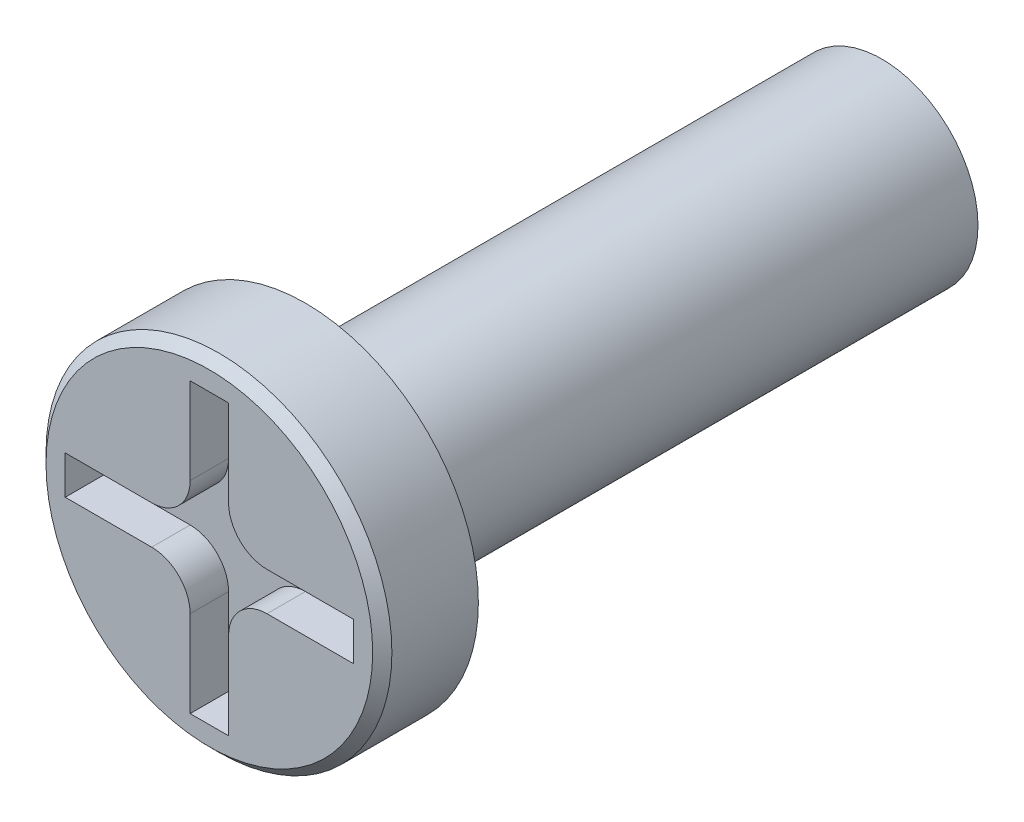
ISO-10303-21;
HEADER;
FILE_DESCRIPTION(('STEP AP214'),'2;1');
FILE_NAME('part.step','',(''),(''),'','','');
FILE_SCHEMA(('AUTOMOTIVE_DESIGN { 1 0 10303 214 1 1 1 1 }'));
ENDSEC;
DATA;
#1=APPLICATION_CONTEXT('core data for automotive mechanical design processes');
#2=APPLICATION_PROTOCOL_DEFINITION('international standard','automotive_design',2000,#1);
#3=PRODUCT_CONTEXT('',#1,'mechanical');
#4=PRODUCT('Part','Part','',(#3));
#5=PRODUCT_RELATED_PRODUCT_CATEGORY('part','',(#4));
#6=PRODUCT_DEFINITION_FORMATION('','',#4);
#7=PRODUCT_DEFINITION_CONTEXT('part definition',#1,'design');
#8=PRODUCT_DEFINITION('design','',#6,#7);
#9=PRODUCT_DEFINITION_SHAPE('','',#8);
#10=(LENGTH_UNIT() NAMED_UNIT(*) SI_UNIT(.MILLI.,.METRE.));
#11=(NAMED_UNIT(*) PLANE_ANGLE_UNIT() SI_UNIT($,.RADIAN.));
#12=(NAMED_UNIT(*) SI_UNIT($,.STERADIAN.) SOLID_ANGLE_UNIT());
#13=UNCERTAINTY_MEASURE_WITH_UNIT(LENGTH_MEASURE(1.E-05),#10,'distance_accuracy_value','');
#14=(GEOMETRIC_REPRESENTATION_CONTEXT(3) GLOBAL_UNCERTAINTY_ASSIGNED_CONTEXT((#13)) GLOBAL_UNIT_ASSIGNED_CONTEXT((#10,
#11,#12)) REPRESENTATION_CONTEXT('',''));
#15=CARTESIAN_POINT('',(0.,0.,0.));
#16=DIRECTION('',(0.,0.,1.));
#17=DIRECTION('',(1.,0.,0.));
#18=AXIS2_PLACEMENT_3D('',#15,#16,#17);
#19=CARTESIAN_POINT('',(2.93483922046847,2.4375,17.5));
#20=DIRECTION('',(0.,0.,1.));
#21=DIRECTION('',(1.,0.,0.));
#22=AXIS2_PLACEMENT_3D('',#19,#20,#21);
#23=PLANE('',#22);
#24=CARTESIAN_POINT('',(2.93483922046847,2.4375,17.5));
#25=DIRECTION('',(0.,0.,-1.));
#26=DIRECTION('',(1.,0.,0.));
#27=AXIS2_PLACEMENT_3D('',#24,#25,#26);
#28=CIRCLE('',#27,0.5);
#29=CARTESIAN_POINT('',(3.43483922046848,2.4375,17.5));
#30=VERTEX_POINT('',#29);
#31=CARTESIAN_POINT('',(2.43483922046847,2.4375,17.5));
#32=VERTEX_POINT('',#31);
#33=EDGE_CURVE('E264',#30,#32,#28,.T.);
#34=ORIENTED_EDGE('',*,*,#33,.T.);
#35=CARTESIAN_POINT('',(2.93483922046847,2.4375,17.5));
#36=DIRECTION('',(0.,0.,-1.));
#37=DIRECTION('',(1.,0.,0.));
#38=AXIS2_PLACEMENT_3D('',#35,#36,#37);
#39=CIRCLE('',#38,0.5);
#40=EDGE_CURVE('E27',#32,#30,#39,.T.);
#41=ORIENTED_EDGE('',*,*,#40,.T.);
#42=EDGE_LOOP('',(#34,#41));
#43=FACE_BOUND('',#42,.T.);
#44=ADVANCED_FACE('F16',(#43),#23,.F.);
#45=CARTESIAN_POINT('',(2.93483922046847,2.4375,20.5));
#46=DIRECTION('',(0.,0.,-1.));
#47=DIRECTION('',(1.,0.,0.));
#48=AXIS2_PLACEMENT_3D('',#45,#46,#47);
#49=CYLINDRICAL_SURFACE('',#48,0.5);
#50=ORIENTED_EDGE('',*,*,#33,.F.);
#51=ORIENTED_EDGE('',*,*,#40,.F.);
#52=DIRECTION('',(0.,0.,1.));
#53=VECTOR('',#52,1.);
#54=CARTESIAN_POINT('',(2.43483922046847,2.4375,20.5));
#55=LINE('',#54,#53);
#56=CARTESIAN_POINT('',(2.43483922046847,2.4375,20.5));
#57=VERTEX_POINT('',#56);
#58=EDGE_CURVE('E11',#32,#57,#55,.T.);
#59=ORIENTED_EDGE('',*,*,#58,.T.);
#60=CARTESIAN_POINT('',(2.93483922046847,2.4375,20.5));
#61=DIRECTION('',(0.,0.,1.));
#62=DIRECTION('',(1.,0.,0.));
#63=AXIS2_PLACEMENT_3D('',#60,#61,#62);
#64=CIRCLE('',#63,0.5);
#65=CARTESIAN_POINT('',(3.43483922046848,2.4375,20.5));
#66=VERTEX_POINT('',#65);
#67=EDGE_CURVE('E239',#66,#57,#64,.T.);
#68=ORIENTED_EDGE('',*,*,#67,.F.);
#69=CARTESIAN_POINT('',(2.93483922046847,2.4375,20.5));
#70=DIRECTION('',(0.,0.,1.));
#71=DIRECTION('',(1.,0.,0.));
#72=AXIS2_PLACEMENT_3D('',#69,#70,#71);
#73=CIRCLE('',#72,0.5);
#74=EDGE_CURVE('E268',#57,#66,#73,.T.);
#75=ORIENTED_EDGE('',*,*,#74,.F.);
#76=ORIENTED_EDGE('',*,*,#58,.F.);
#77=EDGE_LOOP('',(#50,#51,#59,#68,#75,#76));
#78=FACE_BOUND('',#77,.T.);
#79=ADVANCED_FACE('F542',(#78),#49,.T.);
#80=CARTESIAN_POINT('',(2.93483922046847,2.4375,20.5));
#81=DIRECTION('',(0.,0.,1.));
#82=DIRECTION('',(1.,0.,0.));
#83=AXIS2_PLACEMENT_3D('',#80,#81,#82);
#84=PLANE('',#83);
#85=ORIENTED_EDGE('',*,*,#67,.T.);
#86=ORIENTED_EDGE('',*,*,#74,.T.);
#87=EDGE_LOOP('',(#85,#86));
#88=FACE_BOUND('',#87,.T.);
#89=CARTESIAN_POINT('',(2.93483922046847,2.4375,20.5));
#90=DIRECTION('',(0.,0.,1.));
#91=DIRECTION('',(1.,0.,0.));
#92=AXIS2_PLACEMENT_3D('',#89,#90,#91);
#93=CIRCLE('',#92,0.9);
#94=CARTESIAN_POINT('',(3.83483922046848,2.4375,20.5));
#95=VERTEX_POINT('',#94);
#96=CARTESIAN_POINT('',(2.03483922046847,2.4375,20.5));
#97=VERTEX_POINT('',#96);
#98=EDGE_CURVE('E273',#95,#97,#93,.T.);
#99=ORIENTED_EDGE('',*,*,#98,.F.);
#100=CARTESIAN_POINT('',(2.93483922046847,2.4375,20.5));
#101=DIRECTION('',(0.,0.,1.));
#102=DIRECTION('',(1.,0.,0.));
#103=AXIS2_PLACEMENT_3D('',#100,#101,#102);
#104=CIRCLE('',#103,0.9);
#105=EDGE_CURVE('E269',#97,#95,#104,.T.);
#106=ORIENTED_EDGE('',*,*,#105,.F.);
#107=EDGE_LOOP('',(#99,#106));
#108=FACE_BOUND('',#107,.T.);
#109=ADVANCED_FACE('F535',(#88,#108),#84,.F.);
#110=CARTESIAN_POINT('',(2.93483922046847,2.4375,20.8));
#111=DIRECTION('',(0.,0.,1.));
#112=DIRECTION('',(1.,0.,0.));
#113=AXIS2_PLACEMENT_3D('',#110,#111,#112);
#114=PLANE('',#113);
#115=DIRECTION('',(1.,0.,0.));
#116=VECTOR('',#115,1.);
#117=CARTESIAN_POINT('',(3.68483922046847,2.5375,20.8));
#118=LINE('',#117,#116);
#119=CARTESIAN_POINT('',(3.23483922046848,2.5375,20.8));
#120=VERTEX_POINT('',#119);
#121=CARTESIAN_POINT('',(3.68483922046847,2.5375,20.8));
#122=VERTEX_POINT('',#121);
#123=EDGE_CURVE('E236',#120,#122,#118,.T.);
#124=ORIENTED_EDGE('',*,*,#123,.F.);
#125=CARTESIAN_POINT('',(3.23483922046848,2.7375,20.8));
#126=DIRECTION('',(0.,0.,1.));
#127=DIRECTION('',(1.,0.,0.));
#128=AXIS2_PLACEMENT_3D('',#125,#126,#127);
#129=CIRCLE('',#128,0.2);
#130=CARTESIAN_POINT('',(3.03483922046847,2.7375,20.8));
#131=VERTEX_POINT('',#130);
#132=EDGE_CURVE('E275',#131,#120,#129,.T.);
#133=ORIENTED_EDGE('',*,*,#132,.F.);
#134=DIRECTION('',(0.,-1.,0.));
#135=VECTOR('',#134,1.);
#136=CARTESIAN_POINT('',(3.03483922046847,2.7375,20.8));
#137=LINE('',#136,#135);
#138=CARTESIAN_POINT('',(3.03483922046847,3.1875,20.8));
#139=VERTEX_POINT('',#138);
#140=EDGE_CURVE('E212',#139,#131,#137,.T.);
#141=ORIENTED_EDGE('',*,*,#140,.F.);
#142=DIRECTION('',(1.,0.,0.));
#143=VECTOR('',#142,1.);
#144=CARTESIAN_POINT('',(3.03483922046847,3.1875,20.8));
#145=LINE('',#144,#143);
#146=CARTESIAN_POINT('',(2.83483922046847,3.1875,20.8));
#147=VERTEX_POINT('',#146);
#148=EDGE_CURVE('E321',#147,#139,#145,.T.);
#149=ORIENTED_EDGE('',*,*,#148,.F.);
#150=DIRECTION('',(0.,1.,0.));
#151=VECTOR('',#150,1.);
#152=CARTESIAN_POINT('',(2.83483922046847,3.1875,20.8));
#153=LINE('',#152,#151);
#154=CARTESIAN_POINT('',(2.83483922046847,2.7375,20.8));
#155=VERTEX_POINT('',#154);
#156=EDGE_CURVE('E279',#155,#147,#153,.T.);
#157=ORIENTED_EDGE('',*,*,#156,.F.);
#158=CARTESIAN_POINT('',(2.63483922046847,2.7375,20.8));
#159=DIRECTION('',(0.,0.,1.));
#160=DIRECTION('',(0.,1.,0.));
#161=AXIS2_PLACEMENT_3D('',#158,#159,#160);
#162=CIRCLE('',#161,0.2);
#163=CARTESIAN_POINT('',(2.63483922046847,2.5375,20.8));
#164=VERTEX_POINT('',#163);
#165=EDGE_CURVE('E359',#164,#155,#162,.T.);
#166=ORIENTED_EDGE('',*,*,#165,.F.);
#167=DIRECTION('',(1.,0.,0.));
#168=VECTOR('',#167,1.);
#169=CARTESIAN_POINT('',(2.63483922046847,2.5375,20.8));
#170=LINE('',#169,#168);
#171=CARTESIAN_POINT('',(2.18483922046848,2.5375,20.8));
#172=VERTEX_POINT('',#171);
#173=EDGE_CURVE('E334',#172,#164,#170,.T.);
#174=ORIENTED_EDGE('',*,*,#173,.F.);
#175=DIRECTION('',(0.,1.,0.));
#176=VECTOR('',#175,1.);
#177=CARTESIAN_POINT('',(2.18483922046848,2.5375,20.8));
#178=LINE('',#177,#176);
#179=CARTESIAN_POINT('',(2.18483922046848,2.3375,20.8));
#180=VERTEX_POINT('',#179);
#181=EDGE_CURVE('E182',#180,#172,#178,.T.);
#182=ORIENTED_EDGE('',*,*,#181,.F.);
#183=DIRECTION('',(-1.,0.,0.));
#184=VECTOR('',#183,1.);
#185=CARTESIAN_POINT('',(2.18483922046848,2.3375,20.8));
#186=LINE('',#185,#184);
#187=CARTESIAN_POINT('',(2.63483922046847,2.3375,20.8));
#188=VERTEX_POINT('',#187);
#189=EDGE_CURVE('E160',#188,#180,#186,.T.);
#190=ORIENTED_EDGE('',*,*,#189,.F.);
#191=CARTESIAN_POINT('',(2.63483922046847,2.1375,20.8));
#192=DIRECTION('',(0.,0.,1.));
#193=DIRECTION('',(-1.,0.,0.));
#194=AXIS2_PLACEMENT_3D('',#191,#192,#193);
#195=CIRCLE('',#194,0.2);
#196=CARTESIAN_POINT('',(2.83483922046847,2.1375,20.8));
#197=VERTEX_POINT('',#196);
#198=EDGE_CURVE('E168',#197,#188,#195,.T.);
#199=ORIENTED_EDGE('',*,*,#198,.F.);
#200=DIRECTION('',(0.,1.,0.));
#201=VECTOR('',#200,1.);
#202=CARTESIAN_POINT('',(2.83483922046847,2.1375,20.8));
#203=LINE('',#202,#201);
#204=CARTESIAN_POINT('',(2.83483922046847,1.6875,20.8));
#205=VERTEX_POINT('',#204);
#206=EDGE_CURVE('E227',#205,#197,#203,.T.);
#207=ORIENTED_EDGE('',*,*,#206,.F.);
#208=DIRECTION('',(-1.,0.,0.));
#209=VECTOR('',#208,1.);
#210=CARTESIAN_POINT('',(2.83483922046847,1.6875,20.8));
#211=LINE('',#210,#209);
#212=CARTESIAN_POINT('',(3.03483922046847,1.6875,20.8));
#213=VERTEX_POINT('',#212);
#214=EDGE_CURVE('E249',#213,#205,#211,.T.);
#215=ORIENTED_EDGE('',*,*,#214,.F.);
#216=DIRECTION('',(0.,-1.,0.));
#217=VECTOR('',#216,1.);
#218=CARTESIAN_POINT('',(3.03483922046847,1.6875,20.8));
#219=LINE('',#218,#217);
#220=CARTESIAN_POINT('',(3.03483922046847,2.1375,20.8));
#221=VERTEX_POINT('',#220);
#222=EDGE_CURVE('E231',#221,#213,#219,.T.);
#223=ORIENTED_EDGE('',*,*,#222,.F.);
#224=CARTESIAN_POINT('',(3.23483922046848,2.1375,20.8));
#225=DIRECTION('',(0.,0.,1.));
#226=DIRECTION('',(0.,-1.,0.));
#227=AXIS2_PLACEMENT_3D('',#224,#225,#226);
#228=CIRCLE('',#227,0.2);
#229=CARTESIAN_POINT('',(3.23483922046848,2.3375,20.8));
#230=VERTEX_POINT('',#229);
#231=EDGE_CURVE('E331',#230,#221,#228,.T.);
#232=ORIENTED_EDGE('',*,*,#231,.F.);
#233=DIRECTION('',(-1.,0.,0.));
#234=VECTOR('',#233,1.);
#235=CARTESIAN_POINT('',(3.23483922046848,2.3375,20.8));
#236=LINE('',#235,#234);
#237=CARTESIAN_POINT('',(3.68483922046847,2.3375,20.8));
#238=VERTEX_POINT('',#237);
#239=EDGE_CURVE('E254',#238,#230,#236,.T.);
#240=ORIENTED_EDGE('',*,*,#239,.F.);
#241=DIRECTION('',(0.,-1.,0.));
#242=VECTOR('',#241,1.);
#243=CARTESIAN_POINT('',(3.68483922046847,2.3375,20.8));
#244=LINE('',#243,#242);
#245=EDGE_CURVE('E240',#122,#238,#244,.T.);
#246=ORIENTED_EDGE('',*,*,#245,.F.);
#247=EDGE_LOOP('',(#124,#133,#141,#149,#157,#166,#174,#182,#190,#199,#207,#215,#223,#232,#240,#246));
#248=FACE_BOUND('',#247,.T.);
#249=ADVANCED_FACE('F180',(#248),#114,.T.);
#250=CARTESIAN_POINT('',(3.23483922046848,2.5375,21.));
#251=DIRECTION('',(0.,1.,0.));
#252=DIRECTION('',(1.,0.,0.));
#253=AXIS2_PLACEMENT_3D('',#250,#251,#252);
#254=PLANE('',#253);
#255=DIRECTION('',(1.,0.,0.));
#256=VECTOR('',#255,1.);
#257=CARTESIAN_POINT('',(1.53144959981361,2.5375,21.));
#258=LINE('',#257,#256);
#259=CARTESIAN_POINT('',(3.23483922046848,2.5375,21.));
#260=VERTEX_POINT('',#259);
#261=CARTESIAN_POINT('',(3.68483922046847,2.5375,21.));
#262=VERTEX_POINT('',#261);
#263=EDGE_CURVE('E221',#260,#262,#258,.T.);
#264=ORIENTED_EDGE('',*,*,#263,.F.);
#265=DIRECTION('',(0.,0.,-1.));
#266=VECTOR('',#265,1.);
#267=CARTESIAN_POINT('',(3.23483922046848,2.5375,21.));
#268=LINE('',#267,#266);
#269=EDGE_CURVE('E220',#260,#120,#268,.T.);
#270=ORIENTED_EDGE('',*,*,#269,.T.);
#271=ORIENTED_EDGE('',*,*,#123,.T.);
#272=DIRECTION('',(0.,0.,-1.));
#273=VECTOR('',#272,1.);
#274=CARTESIAN_POINT('',(3.68483922046847,2.5375,21.));
#275=LINE('',#274,#273);
#276=EDGE_CURVE('E250',#262,#122,#275,.T.);
#277=ORIENTED_EDGE('',*,*,#276,.F.);
#278=EDGE_LOOP('',(#264,#270,#271,#277));
#279=FACE_BOUND('',#278,.T.);
#280=ADVANCED_FACE('F534',(#279),#254,.F.);
#281=CARTESIAN_POINT('',(3.68483922046847,2.5375,21.));
#282=DIRECTION('',(1.,0.,0.));
#283=DIRECTION('',(0.,1.,0.));
#284=AXIS2_PLACEMENT_3D('',#281,#282,#283);
#285=PLANE('',#284);
#286=DIRECTION('',(0.,-1.,0.));
#287=VECTOR('',#286,1.);
#288=CARTESIAN_POINT('',(3.68483922046847,1.26875,21.));
#289=LINE('',#288,#287);
#290=CARTESIAN_POINT('',(3.68483922046847,2.3375,21.));
#291=VERTEX_POINT('',#290);
#292=EDGE_CURVE('E225',#262,#291,#289,.T.);
#293=ORIENTED_EDGE('',*,*,#292,.F.);
#294=ORIENTED_EDGE('',*,*,#276,.T.);
#295=ORIENTED_EDGE('',*,*,#245,.T.);
#296=DIRECTION('',(0.,0.,-1.));
#297=VECTOR('',#296,1.);
#298=CARTESIAN_POINT('',(3.68483922046847,2.3375,21.));
#299=LINE('',#298,#297);
#300=EDGE_CURVE('E327',#291,#238,#299,.T.);
#301=ORIENTED_EDGE('',*,*,#300,.F.);
#302=EDGE_LOOP('',(#293,#294,#295,#301));
#303=FACE_BOUND('',#302,.T.);
#304=ADVANCED_FACE('F571',(#303),#285,.F.);
#305=CARTESIAN_POINT('',(3.68483922046847,2.3375,21.));
#306=DIRECTION('',(0.,-1.,0.));
#307=DIRECTION('',(0.,0.,-1.));
#308=AXIS2_PLACEMENT_3D('',#305,#306,#307);
#309=PLANE('',#308);
#310=DIRECTION('',(-1.,0.,0.));
#311=VECTOR('',#310,1.);
#312=CARTESIAN_POINT('',(1.75644959981361,2.3375,21.));
#313=LINE('',#312,#311);
#314=CARTESIAN_POINT('',(3.23483922046848,2.3375,21.));
#315=VERTEX_POINT('',#314);
#316=EDGE_CURVE('E241',#291,#315,#313,.T.);
#317=ORIENTED_EDGE('',*,*,#316,.F.);
#318=ORIENTED_EDGE('',*,*,#300,.T.);
#319=ORIENTED_EDGE('',*,*,#239,.T.);
#320=DIRECTION('',(0.,0.,-1.));
#321=VECTOR('',#320,1.);
#322=CARTESIAN_POINT('',(3.23483922046848,2.3375,21.));
#323=LINE('',#322,#321);
#324=EDGE_CURVE('E234',#315,#230,#323,.T.);
#325=ORIENTED_EDGE('',*,*,#324,.F.);
#326=EDGE_LOOP('',(#317,#318,#319,#325));
#327=FACE_BOUND('',#326,.T.);
#328=ADVANCED_FACE('F511',(#327),#309,.F.);
#329=CARTESIAN_POINT('',(3.23483922046848,2.1375,21.));
#330=DIRECTION('',(0.,0.,-1.));
#331=DIRECTION('',(0.,-1.,0.));
#332=AXIS2_PLACEMENT_3D('',#329,#330,#331);
#333=CYLINDRICAL_SURFACE('',#332,0.2);
#334=CARTESIAN_POINT('',(3.23483922046848,2.1375,21.));
#335=DIRECTION('',(0.,0.,1.));
#336=DIRECTION('',(0.,-1.,0.));
#337=AXIS2_PLACEMENT_3D('',#334,#335,#336);
#338=CIRCLE('',#337,0.2);
#339=CARTESIAN_POINT('',(3.03483922046847,2.1375,21.));
#340=VERTEX_POINT('',#339);
#341=EDGE_CURVE('E245',#315,#340,#338,.T.);
#342=ORIENTED_EDGE('',*,*,#341,.F.);
#343=ORIENTED_EDGE('',*,*,#324,.T.);
#344=ORIENTED_EDGE('',*,*,#231,.T.);
#345=DIRECTION('',(0.,0.,-1.));
#346=VECTOR('',#345,1.);
#347=CARTESIAN_POINT('',(3.03483922046847,2.1375,21.));
#348=LINE('',#347,#346);
#349=EDGE_CURVE('E235',#340,#221,#348,.T.);
#350=ORIENTED_EDGE('',*,*,#349,.F.);
#351=EDGE_LOOP('',(#342,#343,#344,#350));
#352=FACE_BOUND('',#351,.T.);
#353=ADVANCED_FACE('F502',(#352),#333,.T.);
#354=CARTESIAN_POINT('',(3.03483922046847,2.1375,21.));
#355=DIRECTION('',(1.,0.,0.));
#356=DIRECTION('',(0.,1.,0.));
#357=AXIS2_PLACEMENT_3D('',#354,#355,#356);
#358=PLANE('',#357);
#359=DIRECTION('',(0.,-1.,0.));
#360=VECTOR('',#359,1.);
#361=CARTESIAN_POINT('',(3.03483922046847,1.06875,21.));
#362=LINE('',#361,#360);
#363=CARTESIAN_POINT('',(3.03483922046847,1.6875,21.));
#364=VERTEX_POINT('',#363);
#365=EDGE_CURVE('E260',#340,#364,#362,.T.);
#366=ORIENTED_EDGE('',*,*,#365,.F.);
#367=ORIENTED_EDGE('',*,*,#349,.T.);
#368=ORIENTED_EDGE('',*,*,#222,.T.);
#369=DIRECTION('',(0.,0.,-1.));
#370=VECTOR('',#369,1.);
#371=CARTESIAN_POINT('',(3.03483922046847,1.6875,21.));
#372=LINE('',#371,#370);
#373=EDGE_CURVE('E230',#364,#213,#372,.T.);
#374=ORIENTED_EDGE('',*,*,#373,.F.);
#375=EDGE_LOOP('',(#366,#367,#368,#374));
#376=FACE_BOUND('',#375,.T.);
#377=ADVANCED_FACE('F497',(#376),#358,.F.);
#378=CARTESIAN_POINT('',(3.03483922046847,1.6875,21.));
#379=DIRECTION('',(0.,-1.,0.));
#380=DIRECTION('',(0.,0.,-1.));
#381=AXIS2_PLACEMENT_3D('',#378,#379,#380);
#382=PLANE('',#381);
#383=DIRECTION('',(-1.,0.,0.));
#384=VECTOR('',#383,1.);
#385=CARTESIAN_POINT('',(1.43144959981361,1.6875,21.));
#386=LINE('',#385,#384);
#387=CARTESIAN_POINT('',(2.83483922046847,1.6875,21.));
#388=VERTEX_POINT('',#387);
#389=EDGE_CURVE('E205',#364,#388,#386,.T.);
#390=ORIENTED_EDGE('',*,*,#389,.F.);
#391=ORIENTED_EDGE('',*,*,#373,.T.);
#392=ORIENTED_EDGE('',*,*,#214,.T.);
#393=DIRECTION('',(0.,0.,-1.));
#394=VECTOR('',#393,1.);
#395=CARTESIAN_POINT('',(2.83483922046847,1.6875,21.));
#396=LINE('',#395,#394);
#397=EDGE_CURVE('E177',#388,#205,#396,.T.);
#398=ORIENTED_EDGE('',*,*,#397,.F.);
#399=EDGE_LOOP('',(#390,#391,#392,#398));
#400=FACE_BOUND('',#399,.T.);
#401=ADVANCED_FACE('F492',(#400),#382,.F.);
#402=CARTESIAN_POINT('',(2.83483922046847,1.6875,21.));
#403=DIRECTION('',(-1.,0.,0.));
#404=DIRECTION('',(0.,0.,1.));
#405=AXIS2_PLACEMENT_3D('',#402,#403,#404);
#406=PLANE('',#405);
#407=DIRECTION('',(0.,1.,0.));
#408=VECTOR('',#407,1.);
#409=CARTESIAN_POINT('',(2.83483922046847,0.84375,21.));
#410=LINE('',#409,#408);
#411=CARTESIAN_POINT('',(2.83483922046847,2.1375,21.));
#412=VERTEX_POINT('',#411);
#413=EDGE_CURVE('E202',#388,#412,#410,.T.);
#414=ORIENTED_EDGE('',*,*,#413,.F.);
#415=ORIENTED_EDGE('',*,*,#397,.T.);
#416=ORIENTED_EDGE('',*,*,#206,.T.);
#417=DIRECTION('',(0.,0.,-1.));
#418=VECTOR('',#417,1.);
#419=CARTESIAN_POINT('',(2.83483922046847,2.1375,21.));
#420=LINE('',#419,#418);
#421=EDGE_CURVE('E173',#412,#197,#420,.T.);
#422=ORIENTED_EDGE('',*,*,#421,.F.);
#423=EDGE_LOOP('',(#414,#415,#416,#422));
#424=FACE_BOUND('',#423,.T.);
#425=ADVANCED_FACE('F474',(#424),#406,.F.);
#426=CARTESIAN_POINT('',(2.63483922046847,2.1375,21.));
#427=DIRECTION('',(0.,0.,-1.));
#428=DIRECTION('',(-1.,0.,0.));
#429=AXIS2_PLACEMENT_3D('',#426,#427,#428);
#430=CYLINDRICAL_SURFACE('',#429,0.2);
#431=CARTESIAN_POINT('',(2.63483922046847,2.1375,21.));
#432=DIRECTION('',(0.,0.,1.));
#433=DIRECTION('',(-1.,0.,0.));
#434=AXIS2_PLACEMENT_3D('',#431,#432,#433);
#435=CIRCLE('',#434,0.2);
#436=CARTESIAN_POINT('',(2.63483922046847,2.3375,21.));
#437=VERTEX_POINT('',#436);
#438=EDGE_CURVE('E20',#412,#437,#435,.T.);
#439=ORIENTED_EDGE('',*,*,#438,.F.);
#440=ORIENTED_EDGE('',*,*,#421,.T.);
#441=ORIENTED_EDGE('',*,*,#198,.T.);
#442=DIRECTION('',(0.,0.,-1.));
#443=VECTOR('',#442,1.);
#444=CARTESIAN_POINT('',(2.63483922046847,2.3375,21.));
#445=LINE('',#444,#443);
#446=EDGE_CURVE('E171',#437,#188,#445,.T.);
#447=ORIENTED_EDGE('',*,*,#446,.F.);
#448=EDGE_LOOP('',(#439,#440,#441,#447));
#449=FACE_BOUND('',#448,.T.);
#450=ADVANCED_FACE('F170',(#449),#430,.T.);
#451=CARTESIAN_POINT('',(2.63483922046847,2.3375,21.));
#452=DIRECTION('',(0.,-1.,0.));
#453=DIRECTION('',(0.,0.,-1.));
#454=AXIS2_PLACEMENT_3D('',#451,#452,#453);
#455=PLANE('',#454);
#456=DIRECTION('',(-1.,0.,0.));
#457=VECTOR('',#456,1.);
#458=CARTESIAN_POINT('',(1.23144959981361,2.3375,21.));
#459=LINE('',#458,#457);
#460=CARTESIAN_POINT('',(2.18483922046848,2.3375,21.));
#461=VERTEX_POINT('',#460);
#462=EDGE_CURVE('E188',#437,#461,#459,.T.);
#463=ORIENTED_EDGE('',*,*,#462,.F.);
#464=ORIENTED_EDGE('',*,*,#446,.T.);
#465=ORIENTED_EDGE('',*,*,#189,.T.);
#466=DIRECTION('',(0.,0.,-1.));
#467=VECTOR('',#466,1.);
#468=CARTESIAN_POINT('',(2.18483922046848,2.3375,21.));
#469=LINE('',#468,#467);
#470=EDGE_CURVE('E196',#461,#180,#469,.T.);
#471=ORIENTED_EDGE('',*,*,#470,.F.);
#472=EDGE_LOOP('',(#463,#464,#465,#471));
#473=FACE_BOUND('',#472,.T.);
#474=ADVANCED_FACE('F186',(#473),#455,.F.);
#475=CARTESIAN_POINT('',(2.18483922046848,2.3375,21.));
#476=DIRECTION('',(-1.,0.,0.));
#477=DIRECTION('',(0.,0.,1.));
#478=AXIS2_PLACEMENT_3D('',#475,#476,#477);
#479=PLANE('',#478);
#480=DIRECTION('',(0.,1.,0.));
#481=VECTOR('',#480,1.);
#482=CARTESIAN_POINT('',(2.18483922046848,1.16875,21.));
#483=LINE('',#482,#481);
#484=CARTESIAN_POINT('',(2.18483922046848,2.5375,21.));
#485=VERTEX_POINT('',#484);
#486=EDGE_CURVE('E257',#461,#485,#483,.T.);
#487=ORIENTED_EDGE('',*,*,#486,.F.);
#488=ORIENTED_EDGE('',*,*,#470,.T.);
#489=ORIENTED_EDGE('',*,*,#181,.T.);
#490=DIRECTION('',(0.,0.,-1.));
#491=VECTOR('',#490,1.);
#492=CARTESIAN_POINT('',(2.18483922046848,2.5375,21.));
#493=LINE('',#492,#491);
#494=EDGE_CURVE('E338',#485,#172,#493,.T.);
#495=ORIENTED_EDGE('',*,*,#494,.F.);
#496=EDGE_LOOP('',(#487,#488,#489,#495));
#497=FACE_BOUND('',#496,.T.);
#498=ADVANCED_FACE('F402',(#497),#479,.F.);
#499=CARTESIAN_POINT('',(2.18483922046848,2.5375,21.));
#500=DIRECTION('',(0.,1.,0.));
#501=DIRECTION('',(1.,0.,0.));
#502=AXIS2_PLACEMENT_3D('',#499,#500,#501);
#503=PLANE('',#502);
#504=DIRECTION('',(1.,0.,0.));
#505=VECTOR('',#504,1.);
#506=CARTESIAN_POINT('',(1.00644959981361,2.5375,21.));
#507=LINE('',#506,#505);
#508=CARTESIAN_POINT('',(2.63483922046847,2.5375,21.));
#509=VERTEX_POINT('',#508);
#510=EDGE_CURVE('E211',#485,#509,#507,.T.);
#511=ORIENTED_EDGE('',*,*,#510,.F.);
#512=ORIENTED_EDGE('',*,*,#494,.T.);
#513=ORIENTED_EDGE('',*,*,#173,.T.);
#514=DIRECTION('',(0.,0.,-1.));
#515=VECTOR('',#514,1.);
#516=CARTESIAN_POINT('',(2.63483922046847,2.5375,21.));
#517=LINE('',#516,#515);
#518=EDGE_CURVE('E283',#509,#164,#517,.T.);
#519=ORIENTED_EDGE('',*,*,#518,.F.);
#520=EDGE_LOOP('',(#511,#512,#513,#519));
#521=FACE_BOUND('',#520,.T.);
#522=ADVANCED_FACE('F397',(#521),#503,.F.);
#523=CARTESIAN_POINT('',(2.63483922046847,2.7375,21.));
#524=DIRECTION('',(0.,0.,-1.));
#525=DIRECTION('',(0.,1.,0.));
#526=AXIS2_PLACEMENT_3D('',#523,#524,#525);
#527=CYLINDRICAL_SURFACE('',#526,0.2);
#528=CARTESIAN_POINT('',(2.63483922046847,2.7375,21.));
#529=DIRECTION('',(0.,0.,1.));
#530=DIRECTION('',(0.,1.,0.));
#531=AXIS2_PLACEMENT_3D('',#528,#529,#530);
#532=CIRCLE('',#531,0.2);
#533=CARTESIAN_POINT('',(2.83483922046847,2.7375,21.));
#534=VERTEX_POINT('',#533);
#535=EDGE_CURVE('E206',#509,#534,#532,.T.);
#536=ORIENTED_EDGE('',*,*,#535,.F.);
#537=ORIENTED_EDGE('',*,*,#518,.T.);
#538=ORIENTED_EDGE('',*,*,#165,.T.);
#539=DIRECTION('',(0.,0.,-1.));
#540=VECTOR('',#539,1.);
#541=CARTESIAN_POINT('',(2.83483922046847,2.7375,21.));
#542=LINE('',#541,#540);
#543=EDGE_CURVE('E284',#534,#155,#542,.T.);
#544=ORIENTED_EDGE('',*,*,#543,.F.);
#545=EDGE_LOOP('',(#536,#537,#538,#544));
#546=FACE_BOUND('',#545,.T.);
#547=ADVANCED_FACE('F18',(#546),#527,.T.);
#548=CARTESIAN_POINT('',(2.83483922046847,2.7375,21.));
#549=DIRECTION('',(-1.,0.,0.));
#550=DIRECTION('',(0.,0.,1.));
#551=AXIS2_PLACEMENT_3D('',#548,#549,#550);
#552=PLANE('',#551);
#553=DIRECTION('',(0.,1.,0.));
#554=VECTOR('',#553,1.);
#555=CARTESIAN_POINT('',(2.83483922046847,1.36875,21.));
#556=LINE('',#555,#554);
#557=CARTESIAN_POINT('',(2.83483922046847,3.1875,21.));
#558=VERTEX_POINT('',#557);
#559=EDGE_CURVE('E210',#534,#558,#556,.T.);
#560=ORIENTED_EDGE('',*,*,#559,.F.);
#561=ORIENTED_EDGE('',*,*,#543,.T.);
#562=ORIENTED_EDGE('',*,*,#156,.T.);
#563=DIRECTION('',(0.,0.,-1.));
#564=VECTOR('',#563,1.);
#565=CARTESIAN_POINT('',(2.83483922046847,3.1875,21.));
#566=LINE('',#565,#564);
#567=EDGE_CURVE('E215',#558,#147,#566,.T.);
#568=ORIENTED_EDGE('',*,*,#567,.F.);
#569=EDGE_LOOP('',(#560,#561,#562,#568));
#570=FACE_BOUND('',#569,.T.);
#571=ADVANCED_FACE('F432',(#570),#552,.F.);
#572=CARTESIAN_POINT('',(2.83483922046847,3.1875,21.));
#573=DIRECTION('',(0.,1.,0.));
#574=DIRECTION('',(1.,0.,0.));
#575=AXIS2_PLACEMENT_3D('',#572,#573,#574);
#576=PLANE('',#575);
#577=DIRECTION('',(1.,0.,0.));
#578=VECTOR('',#577,1.);
#579=CARTESIAN_POINT('',(1.33144959981361,3.1875,21.));
#580=LINE('',#579,#578);
#581=CARTESIAN_POINT('',(3.03483922046847,3.1875,21.));
#582=VERTEX_POINT('',#581);
#583=EDGE_CURVE('E285',#558,#582,#580,.T.);
#584=ORIENTED_EDGE('',*,*,#583,.F.);
#585=ORIENTED_EDGE('',*,*,#567,.T.);
#586=ORIENTED_EDGE('',*,*,#148,.T.);
#587=DIRECTION('',(0.,0.,-1.));
#588=VECTOR('',#587,1.);
#589=CARTESIAN_POINT('',(3.03483922046847,3.1875,21.));
#590=LINE('',#589,#588);
#591=EDGE_CURVE('E216',#582,#139,#590,.T.);
#592=ORIENTED_EDGE('',*,*,#591,.F.);
#593=EDGE_LOOP('',(#584,#585,#586,#592));
#594=FACE_BOUND('',#593,.T.);
#595=ADVANCED_FACE('F438',(#594),#576,.F.);
#596=CARTESIAN_POINT('',(3.03483922046847,3.1875,21.));
#597=DIRECTION('',(1.,0.,0.));
#598=DIRECTION('',(0.,1.,0.));
#599=AXIS2_PLACEMENT_3D('',#596,#597,#598);
#600=PLANE('',#599);
#601=DIRECTION('',(0.,-1.,0.));
#602=VECTOR('',#601,1.);
#603=CARTESIAN_POINT('',(3.03483922046847,1.59375,21.));
#604=LINE('',#603,#602);
#605=CARTESIAN_POINT('',(3.03483922046847,2.7375,21.));
#606=VERTEX_POINT('',#605);
#607=EDGE_CURVE('E289',#582,#606,#604,.T.);
#608=ORIENTED_EDGE('',*,*,#607,.F.);
#609=ORIENTED_EDGE('',*,*,#591,.T.);
#610=ORIENTED_EDGE('',*,*,#140,.T.);
#611=DIRECTION('',(0.,0.,-1.));
#612=VECTOR('',#611,1.);
#613=CARTESIAN_POINT('',(3.03483922046847,2.7375,21.));
#614=LINE('',#613,#612);
#615=EDGE_CURVE('E200',#606,#131,#614,.T.);
#616=ORIENTED_EDGE('',*,*,#615,.F.);
#617=EDGE_LOOP('',(#608,#609,#610,#616));
#618=FACE_BOUND('',#617,.T.);
#619=ADVANCED_FACE('F458',(#618),#600,.F.);
#620=CARTESIAN_POINT('',(3.23483922046848,2.7375,21.));
#621=DIRECTION('',(0.,0.,-1.));
#622=DIRECTION('',(1.,0.,0.));
#623=AXIS2_PLACEMENT_3D('',#620,#621,#622);
#624=CYLINDRICAL_SURFACE('',#623,0.2);
#625=CARTESIAN_POINT('',(3.23483922046848,2.7375,21.));
#626=DIRECTION('',(0.,0.,1.));
#627=DIRECTION('',(1.,0.,0.));
#628=AXIS2_PLACEMENT_3D('',#625,#626,#627);
#629=CIRCLE('',#628,0.2);
#630=EDGE_CURVE('E226',#606,#260,#629,.T.);
#631=ORIENTED_EDGE('',*,*,#630,.F.);
#632=ORIENTED_EDGE('',*,*,#615,.T.);
#633=ORIENTED_EDGE('',*,*,#132,.T.);
#634=ORIENTED_EDGE('',*,*,#269,.F.);
#635=EDGE_LOOP('',(#631,#632,#633,#634));
#636=FACE_BOUND('',#635,.T.);
#637=ADVANCED_FACE('F463',(#636),#624,.T.);
#638=CARTESIAN_POINT('',(2.93483922046847,2.4375,20.5));
#639=DIRECTION('',(0.,0.,1.));
#640=DIRECTION('',(1.,0.,0.));
#641=AXIS2_PLACEMENT_3D('',#638,#639,#640);
#642=CYLINDRICAL_SURFACE('',#641,0.9);
#643=CARTESIAN_POINT('',(2.93483922046847,2.4375,20.95));
#644=DIRECTION('',(0.,0.,1.));
#645=DIRECTION('',(1.,0.,0.));
#646=AXIS2_PLACEMENT_3D('',#643,#644,#645);
#647=CIRCLE('',#646,0.9);
#648=CARTESIAN_POINT('',(2.03483922046847,2.4375,20.95));
#649=VERTEX_POINT('',#648);
#650=EDGE_CURVE('E294',#649,#649,#647,.T.);
#651=ORIENTED_EDGE('',*,*,#650,.F.);
#652=DIRECTION('',(0.,0.,-1.));
#653=VECTOR('',#652,1.);
#654=CARTESIAN_POINT('',(2.03483922046847,2.4375,20.5));
#655=LINE('',#654,#653);
#656=EDGE_CURVE('E274',#649,#97,#655,.T.);
#657=ORIENTED_EDGE('',*,*,#656,.T.);
#658=ORIENTED_EDGE('',*,*,#105,.T.);
#659=ORIENTED_EDGE('',*,*,#98,.T.);
#660=ORIENTED_EDGE('',*,*,#656,.F.);
#661=EDGE_LOOP('',(#651,#657,#658,#659,#660));
#662=FACE_BOUND('',#661,.T.);
#663=ADVANCED_FACE('F480',(#662),#642,.T.);
#664=CARTESIAN_POINT('',(-0.171940020841262,0.,21.));
#665=DIRECTION('',(0.,0.,1.));
#666=DIRECTION('',(1.,0.,0.));
#667=AXIS2_PLACEMENT_3D('',#664,#665,#666);
#668=PLANE('',#667);
#669=ORIENTED_EDGE('',*,*,#630,.T.);
#670=ORIENTED_EDGE('',*,*,#263,.T.);
#671=ORIENTED_EDGE('',*,*,#292,.T.);
#672=ORIENTED_EDGE('',*,*,#316,.T.);
#673=ORIENTED_EDGE('',*,*,#341,.T.);
#674=ORIENTED_EDGE('',*,*,#365,.T.);
#675=ORIENTED_EDGE('',*,*,#389,.T.);
#676=ORIENTED_EDGE('',*,*,#413,.T.);
#677=ORIENTED_EDGE('',*,*,#438,.T.);
#678=ORIENTED_EDGE('',*,*,#462,.T.);
#679=ORIENTED_EDGE('',*,*,#486,.T.);
#680=ORIENTED_EDGE('',*,*,#510,.T.);
#681=ORIENTED_EDGE('',*,*,#535,.T.);
#682=ORIENTED_EDGE('',*,*,#559,.T.);
#683=ORIENTED_EDGE('',*,*,#583,.T.);
#684=ORIENTED_EDGE('',*,*,#607,.T.);
#685=EDGE_LOOP('',(#669,#670,#671,#672,#673,#674,#675,#676,#677,#678,#679,#680,#681,#682,#683,#684));
#686=FACE_BOUND('',#685,.T.);
#687=CARTESIAN_POINT('',(2.93483922046847,2.4375,21.));
#688=DIRECTION('',(0.,0.,-1.));
#689=DIRECTION('',(1.,0.,0.));
#690=AXIS2_PLACEMENT_3D('',#687,#688,#689);
#691=CIRCLE('',#690,0.85);
#692=CARTESIAN_POINT('',(2.08483922046847,2.4375,21.));
#693=VERTEX_POINT('',#692);
#694=EDGE_CURVE('E293',#693,#693,#691,.T.);
#695=ORIENTED_EDGE('',*,*,#694,.F.);
#696=EDGE_LOOP('',(#695));
#697=FACE_BOUND('',#696,.T.);
#698=ADVANCED_FACE('F442',(#686,#697),#668,.T.);
#699=CARTESIAN_POINT('',(2.93483922046847,2.4375,20.975));
#700=DIRECTION('',(0.,0.,-1.));
#701=DIRECTION('',(1.,0.,0.));
#702=AXIS2_PLACEMENT_3D('',#699,#700,#701);
#703=CONICAL_SURFACE('',#702,0.875,0.785398163397459);
#704=ORIENTED_EDGE('',*,*,#650,.T.);
#705=DIRECTION('',(0.707106781186555,0.,0.70710678118654));
#706=VECTOR('',#705,1.);
#707=CARTESIAN_POINT('',(2.05983922046847,2.4375,20.975));
#708=LINE('',#707,#706);
#709=EDGE_CURVE('E290',#649,#693,#708,.T.);
#710=ORIENTED_EDGE('',*,*,#709,.T.);
#711=ORIENTED_EDGE('',*,*,#694,.T.);
#712=ORIENTED_EDGE('',*,*,#709,.F.);
#713=EDGE_LOOP('',(#704,#710,#711,#712));
#714=FACE_BOUND('',#713,.T.);
#715=ADVANCED_FACE('F556',(#714),#703,.T.);
#716=CLOSED_SHELL('',(#44,#79,#109,#249,#280,#304,#328,#353,#377,#401,#425,#450,#474,#498,#522,
#547,#571,#595,#619,#637,#663,#698,#715));
#717=MANIFOLD_SOLID_BREP('B1',#716);
#718=ADVANCED_BREP_SHAPE_REPRESENTATION('',(#18,#717),#14);
#719=SHAPE_DEFINITION_REPRESENTATION(#9,#718);
ENDSEC;
END-ISO-10303-21;
